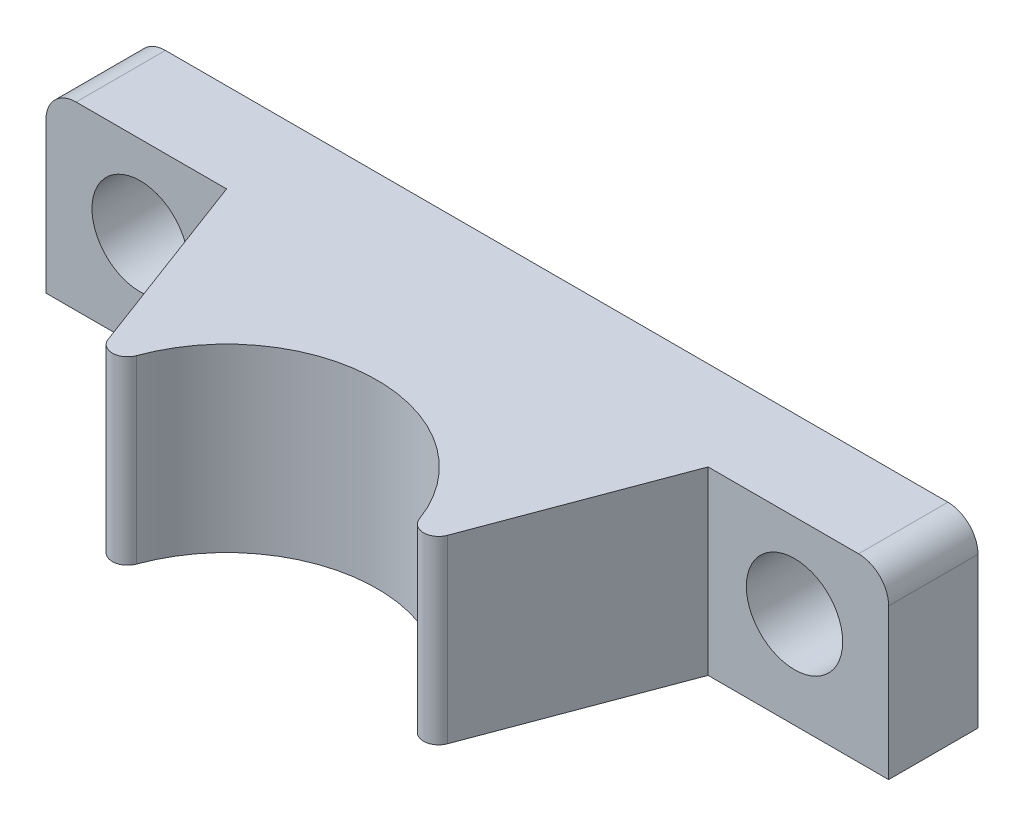
ISO-10303-21;
HEADER;
FILE_DESCRIPTION(('STEP AP214'),'2;1');
FILE_NAME('part.step','',(''),(''),'','','');
FILE_SCHEMA(('AUTOMOTIVE_DESIGN { 1 0 10303 214 1 1 1 1 }'));
ENDSEC;
DATA;
#1=APPLICATION_CONTEXT('core data for automotive mechanical design processes');
#2=APPLICATION_PROTOCOL_DEFINITION('international standard','automotive_design',2000,#1);
#3=PRODUCT_CONTEXT('',#1,'mechanical');
#4=PRODUCT('Part','Part','',(#3));
#5=PRODUCT_RELATED_PRODUCT_CATEGORY('part','',(#4));
#6=PRODUCT_DEFINITION_FORMATION('','',#4);
#7=PRODUCT_DEFINITION_CONTEXT('part definition',#1,'design');
#8=PRODUCT_DEFINITION('design','',#6,#7);
#9=PRODUCT_DEFINITION_SHAPE('','',#8);
#10=(LENGTH_UNIT() NAMED_UNIT(*) SI_UNIT(.MILLI.,.METRE.));
#11=(NAMED_UNIT(*) PLANE_ANGLE_UNIT() SI_UNIT($,.RADIAN.));
#12=(NAMED_UNIT(*) SI_UNIT($,.STERADIAN.) SOLID_ANGLE_UNIT());
#13=UNCERTAINTY_MEASURE_WITH_UNIT(LENGTH_MEASURE(1.E-05),#10,'distance_accuracy_value','');
#14=(GEOMETRIC_REPRESENTATION_CONTEXT(3) GLOBAL_UNCERTAINTY_ASSIGNED_CONTEXT((#13)) GLOBAL_UNIT_ASSIGNED_CONTEXT((#10,
#11,#12)) REPRESENTATION_CONTEXT('',''));
#15=CARTESIAN_POINT('',(0.,0.,0.));
#16=DIRECTION('',(0.,0.,1.));
#17=DIRECTION('',(1.,0.,0.));
#18=AXIS2_PLACEMENT_3D('',#15,#16,#17);
#19=CARTESIAN_POINT('',(17.6143708985289,35.4634604627299,38.1716360974316));
#20=DIRECTION('',(-1.,0.,0.));
#21=DIRECTION('',(0.,0.,1.));
#22=AXIS2_PLACEMENT_3D('',#19,#20,#21);
#23=PLANE('',#22);
#24=DIRECTION('',(0.,1.,0.));
#25=VECTOR('',#24,1.);
#26=CARTESIAN_POINT('',(17.6143708985289,35.4634604627299,38.1716360974316));
#27=LINE('',#26,#25);
#28=CARTESIAN_POINT('',(17.6143708985289,35.4634604627299,38.1716360974316));
#29=VERTEX_POINT('',#28);
#30=CARTESIAN_POINT('',(17.6143708985289,40.4634604627299,38.1716360974316));
#31=VERTEX_POINT('',#30);
#32=EDGE_CURVE('E138',#29,#31,#27,.T.);
#33=ORIENTED_EDGE('',*,*,#32,.T.);
#34=DIRECTION('',(0.,0.,1.));
#35=VECTOR('',#34,1.);
#36=CARTESIAN_POINT('',(17.6143708985289,40.4634604627299,38.1716360974316));
#37=LINE('',#36,#35);
#38=CARTESIAN_POINT('',(17.6143708985289,40.4634604627299,35.2025647253161));
#39=VERTEX_POINT('',#38);
#40=EDGE_CURVE('E236',#31,#39,#37,.F.);
#41=ORIENTED_EDGE('',*,*,#40,.T.);
#42=DIRECTION('',(0.,1.,0.));
#43=VECTOR('',#42,1.);
#44=CARTESIAN_POINT('',(17.6143708985289,35.4634604627299,35.2025647253161));
#45=LINE('',#44,#43);
#46=CARTESIAN_POINT('',(17.6143708985289,35.4634604627299,35.2025647253161));
#47=VERTEX_POINT('',#46);
#48=EDGE_CURVE('E161',#47,#39,#45,.T.);
#49=ORIENTED_EDGE('',*,*,#48,.F.);
#50=DIRECTION('',(0.,0.,1.));
#51=VECTOR('',#50,1.);
#52=CARTESIAN_POINT('',(17.6143708985289,35.4634604627299,38.1716360974316));
#53=LINE('',#52,#51);
#54=EDGE_CURVE('E155',#47,#29,#53,.T.);
#55=ORIENTED_EDGE('',*,*,#54,.T.);
#56=EDGE_LOOP('',(#33,#41,#49,#55));
#57=FACE_BOUND('',#56,.T.);
#58=ADVANCED_FACE('F43',(#57),#23,.T.);
#59=CARTESIAN_POINT('',(17.6143708985289,35.4634604627299,35.2025647253161));
#60=DIRECTION('',(0.,0.,-1.));
#61=DIRECTION('',(-1.,0.,0.));
#62=AXIS2_PLACEMENT_3D('',#59,#60,#61);
#63=PLANE('',#62);
#64=CARTESIAN_POINT('',(20.7421375200377,38.6634604627299,35.2025647253161));
#65=DIRECTION('',(0.,0.,-1.));
#66=DIRECTION('',(-1.,0.,0.));
#67=AXIS2_PLACEMENT_3D('',#64,#65,#66);
#68=CIRCLE('',#67,1.6);
#69=CARTESIAN_POINT('',(19.1421375200377,38.6634604627299,35.2025647253161));
#70=VERTEX_POINT('',#69);
#71=EDGE_CURVE('E271',#70,#70,#68,.T.);
#72=ORIENTED_EDGE('',*,*,#71,.F.);
#73=EDGE_LOOP('',(#72));
#74=FACE_BOUND('',#73,.T.);
#75=CARTESIAN_POINT('',(42.4866042770202,38.6634604627299,35.2025647253161));
#76=DIRECTION('',(0.,0.,-1.));
#77=DIRECTION('',(-1.,0.,0.));
#78=AXIS2_PLACEMENT_3D('',#75,#76,#77);
#79=CIRCLE('',#78,1.6);
#80=CARTESIAN_POINT('',(40.8866042770202,38.6634604627299,35.2025647253161));
#81=VERTEX_POINT('',#80);
#82=EDGE_CURVE('E172',#81,#81,#79,.T.);
#83=ORIENTED_EDGE('',*,*,#82,.F.);
#84=EDGE_LOOP('',(#83));
#85=FACE_BOUND('',#84,.T.);
#86=ORIENTED_EDGE('',*,*,#48,.T.);
#87=CARTESIAN_POINT('',(18.6143708985289,40.4634604627299,35.2025647253161));
#88=DIRECTION('',(0.,0.,-1.));
#89=DIRECTION('',(-1.,0.,0.));
#90=AXIS2_PLACEMENT_3D('',#87,#88,#89);
#91=CIRCLE('',#90,1.);
#92=CARTESIAN_POINT('',(18.6143708985289,41.4634604627299,35.2025647253161));
#93=VERTEX_POINT('',#92);
#94=EDGE_CURVE('E242',#39,#93,#91,.T.);
#95=ORIENTED_EDGE('',*,*,#94,.T.);
#96=DIRECTION('',(-1.,0.,0.));
#97=VECTOR('',#96,1.);
#98=CARTESIAN_POINT('',(17.6143708985289,41.4634604627299,35.2025647253161));
#99=LINE('',#98,#97);
#100=CARTESIAN_POINT('',(44.6143708985289,41.4634604627299,35.2025647253161));
#101=VERTEX_POINT('',#100);
#102=EDGE_CURVE('E163',#101,#93,#99,.T.);
#103=ORIENTED_EDGE('',*,*,#102,.F.);
#104=CARTESIAN_POINT('',(44.6143708985289,40.4634604627299,35.2025647253161));
#105=DIRECTION('',(0.,0.,-1.));
#106=DIRECTION('',(-1.,0.,0.));
#107=AXIS2_PLACEMENT_3D('',#104,#105,#106);
#108=CIRCLE('',#107,1.);
#109=CARTESIAN_POINT('',(45.6143708985289,40.4634604627299,35.2025647253161));
#110=VERTEX_POINT('',#109);
#111=EDGE_CURVE('E239',#101,#110,#108,.T.);
#112=ORIENTED_EDGE('',*,*,#111,.T.);
#113=DIRECTION('',(0.,1.,0.));
#114=VECTOR('',#113,1.);
#115=CARTESIAN_POINT('',(45.6143708985289,35.4634604627299,35.2025647253161));
#116=LINE('',#115,#114);
#117=CARTESIAN_POINT('',(45.6143708985289,35.4634604627299,35.2025647253161));
#118=VERTEX_POINT('',#117);
#119=EDGE_CURVE('E213',#118,#110,#116,.T.);
#120=ORIENTED_EDGE('',*,*,#119,.F.);
#121=DIRECTION('',(-1.,0.,0.));
#122=VECTOR('',#121,1.);
#123=CARTESIAN_POINT('',(17.6143708985289,35.4634604627299,35.2025647253161));
#124=LINE('',#123,#122);
#125=EDGE_CURVE('E150',#118,#47,#124,.T.);
#126=ORIENTED_EDGE('',*,*,#125,.T.);
#127=EDGE_LOOP('',(#86,#95,#103,#112,#120,#126));
#128=FACE_BOUND('',#127,.T.);
#129=ADVANCED_FACE('F286',(#74,#85,#128),#63,.T.);
#130=CARTESIAN_POINT('',(45.6143708985289,35.4634604627299,38.1716360974316));
#131=DIRECTION('',(1.,0.,0.));
#132=DIRECTION('',(0.,0.,-1.));
#133=AXIS2_PLACEMENT_3D('',#130,#131,#132);
#134=PLANE('',#133);
#135=ORIENTED_EDGE('',*,*,#119,.T.);
#136=DIRECTION('',(0.,0.,-1.));
#137=VECTOR('',#136,1.);
#138=CARTESIAN_POINT('',(45.6143708985289,40.4634604627299,38.1716360974316));
#139=LINE('',#138,#137);
#140=CARTESIAN_POINT('',(45.6143708985289,40.4634604627299,38.1716360974316));
#141=VERTEX_POINT('',#140);
#142=EDGE_CURVE('E245',#110,#141,#139,.F.);
#143=ORIENTED_EDGE('',*,*,#142,.T.);
#144=DIRECTION('',(0.,1.,0.));
#145=VECTOR('',#144,1.);
#146=CARTESIAN_POINT('',(45.6143708985289,35.4634604627299,38.1716360974316));
#147=LINE('',#146,#145);
#148=CARTESIAN_POINT('',(45.6143708985289,35.4634604627299,38.1716360974316));
#149=VERTEX_POINT('',#148);
#150=EDGE_CURVE('E217',#149,#141,#147,.T.);
#151=ORIENTED_EDGE('',*,*,#150,.F.);
#152=DIRECTION('',(0.,0.,-1.));
#153=VECTOR('',#152,1.);
#154=CARTESIAN_POINT('',(45.6143708985289,35.4634604627299,38.1716360974316));
#155=LINE('',#154,#153);
#156=EDGE_CURVE('E188',#149,#118,#155,.T.);
#157=ORIENTED_EDGE('',*,*,#156,.T.);
#158=EDGE_LOOP('',(#135,#143,#151,#157));
#159=FACE_BOUND('',#158,.T.);
#160=ADVANCED_FACE('F289',(#159),#134,.T.);
#161=CARTESIAN_POINT('',(39.6143708985289,35.4634604627299,38.1716360974316));
#162=DIRECTION('',(0.,0.,1.));
#163=DIRECTION('',(1.,0.,0.));
#164=AXIS2_PLACEMENT_3D('',#161,#162,#163);
#165=PLANE('',#164);
#166=CARTESIAN_POINT('',(42.4866042770202,38.6634604627299,38.1716360974316));
#167=DIRECTION('',(0.,0.,1.));
#168=DIRECTION('',(1.,0.,0.));
#169=AXIS2_PLACEMENT_3D('',#166,#167,#168);
#170=CIRCLE('',#169,1.6);
#171=CARTESIAN_POINT('',(44.0866042770202,38.6634604627299,38.1716360974316));
#172=VERTEX_POINT('',#171);
#173=EDGE_CURVE('E47',#172,#172,#170,.T.);
#174=ORIENTED_EDGE('',*,*,#173,.F.);
#175=EDGE_LOOP('',(#174));
#176=FACE_BOUND('',#175,.T.);
#177=ORIENTED_EDGE('',*,*,#150,.T.);
#178=CARTESIAN_POINT('',(44.6143708985289,40.4634604627299,38.1716360974316));
#179=DIRECTION('',(0.,0.,1.));
#180=DIRECTION('',(1.,0.,0.));
#181=AXIS2_PLACEMENT_3D('',#178,#179,#180);
#182=CIRCLE('',#181,1.);
#183=CARTESIAN_POINT('',(44.6143708985289,41.4634604627299,38.1716360974316));
#184=VERTEX_POINT('',#183);
#185=EDGE_CURVE('E248',#141,#184,#182,.T.);
#186=ORIENTED_EDGE('',*,*,#185,.T.);
#187=DIRECTION('',(1.,0.,0.));
#188=VECTOR('',#187,1.);
#189=CARTESIAN_POINT('',(39.6143708985289,41.4634604627299,38.1716360974316));
#190=LINE('',#189,#188);
#191=CARTESIAN_POINT('',(39.6143708985289,41.4634604627299,38.1716360974316));
#192=VERTEX_POINT('',#191);
#193=EDGE_CURVE('E169',#192,#184,#190,.T.);
#194=ORIENTED_EDGE('',*,*,#193,.F.);
#195=DIRECTION('',(0.,1.,0.));
#196=VECTOR('',#195,1.);
#197=CARTESIAN_POINT('',(39.6143708985289,35.4634604627299,38.1716360974316));
#198=LINE('',#197,#196);
#199=CARTESIAN_POINT('',(39.6143708985289,35.4634604627299,38.1716360974316));
#200=VERTEX_POINT('',#199);
#201=EDGE_CURVE('E221',#200,#192,#198,.T.);
#202=ORIENTED_EDGE('',*,*,#201,.F.);
#203=DIRECTION('',(1.,0.,0.));
#204=VECTOR('',#203,1.);
#205=CARTESIAN_POINT('',(39.6143708985289,35.4634604627299,38.1716360974316));
#206=LINE('',#205,#204);
#207=EDGE_CURVE('E184',#200,#149,#206,.T.);
#208=ORIENTED_EDGE('',*,*,#207,.T.);
#209=EDGE_LOOP('',(#177,#186,#194,#202,#208));
#210=FACE_BOUND('',#209,.T.);
#211=ADVANCED_FACE('F337',(#176,#210),#165,.T.);
#212=CARTESIAN_POINT('',(39.6143708985289,35.4634604627299,38.1716360974316));
#213=DIRECTION('',(0.936329177569045,0.,0.351123441588391));
#214=DIRECTION('',(0.351123441588391,0.,-0.936329177569045));
#215=AXIS2_PLACEMENT_3D('',#212,#213,#214);
#216=PLANE('',#215);
#217=DIRECTION('',(0.351123441588391,0.,-0.936329177569045));
#218=VECTOR('',#217,1.);
#219=CARTESIAN_POINT('',(39.6143708985289,41.4634604627299,38.1716360974316));
#220=LINE('',#219,#218);
#221=CARTESIAN_POINT('',(37.2523741799725,41.4634604627299,44.4702940135822));
#222=VERTEX_POINT('',#221);
#223=EDGE_CURVE('E204',#222,#192,#220,.T.);
#224=ORIENTED_EDGE('',*,*,#223,.F.);
#225=DIRECTION('',(0.,1.,0.));
#226=VECTOR('',#225,1.);
#227=CARTESIAN_POINT('',(37.2523741799725,35.4634604627299,44.4702940135822));
#228=LINE('',#227,#226);
#229=CARTESIAN_POINT('',(37.2523741799725,35.4634604627299,44.4702940135822));
#230=VERTEX_POINT('',#229);
#231=EDGE_CURVE('E69',#222,#230,#228,.F.);
#232=ORIENTED_EDGE('',*,*,#231,.T.);
#233=DIRECTION('',(0.351123441588391,0.,-0.936329177569045));
#234=VECTOR('',#233,1.);
#235=CARTESIAN_POINT('',(39.6143708985289,35.4634604627299,38.1716360974316));
#236=LINE('',#235,#234);
#237=EDGE_CURVE('E181',#230,#200,#236,.T.);
#238=ORIENTED_EDGE('',*,*,#237,.T.);
#239=ORIENTED_EDGE('',*,*,#201,.T.);
#240=EDGE_LOOP('',(#224,#232,#238,#239));
#241=FACE_BOUND('',#240,.T.);
#242=ADVANCED_FACE('F339',(#241),#216,.T.);
#243=CARTESIAN_POINT('',(31.6143708985289,35.4634604627299,46.1716360974316));
#244=DIRECTION('',(0.,1.,0.));
#245=DIRECTION('',(0.,0.,1.));
#246=AXIS2_PLACEMENT_3D('',#243,#244,#245);
#247=CYLINDRICAL_SURFACE('',#246,5.);
#248=CARTESIAN_POINT('',(31.6143708985289,35.4634604627299,46.1716360974316));
#249=DIRECTION('',(0.,-1.,0.));
#250=DIRECTION('',(0.,0.,1.));
#251=AXIS2_PLACEMENT_3D('',#248,#249,#250);
#252=CIRCLE('',#251,5.);
#253=CARTESIAN_POINT('',(26.9145175415662,35.4634604627299,44.4653599113919));
#254=VERTEX_POINT('',#253);
#255=CARTESIAN_POINT('',(36.3142242554917,35.4634604627299,44.4653599113919));
#256=VERTEX_POINT('',#255);
#257=EDGE_CURVE('E177',#254,#256,#252,.T.);
#258=ORIENTED_EDGE('',*,*,#257,.T.);
#259=DIRECTION('',(0.,1.,0.));
#260=VECTOR('',#259,1.);
#261=CARTESIAN_POINT('',(36.3142242554917,35.4634604627299,44.4653599113919));
#262=LINE('',#261,#260);
#263=CARTESIAN_POINT('',(36.3142242554917,41.4634604627299,44.4653599113919));
#264=VERTEX_POINT('',#263);
#265=EDGE_CURVE('E253',#256,#264,#262,.T.);
#266=ORIENTED_EDGE('',*,*,#265,.T.);
#267=CARTESIAN_POINT('',(31.6143708985289,41.4634604627299,46.1716360974316));
#268=DIRECTION('',(0.,-1.,0.));
#269=DIRECTION('',(0.,0.,1.));
#270=AXIS2_PLACEMENT_3D('',#267,#268,#269);
#271=CIRCLE('',#270,5.);
#272=CARTESIAN_POINT('',(26.9145175415662,41.4634604627299,44.4653599113919));
#273=VERTEX_POINT('',#272);
#274=EDGE_CURVE('E201',#273,#264,#271,.T.);
#275=ORIENTED_EDGE('',*,*,#274,.F.);
#276=DIRECTION('',(0.,1.,0.));
#277=VECTOR('',#276,1.);
#278=CARTESIAN_POINT('',(26.9145175415662,35.4634604627299,44.4653599113919));
#279=LINE('',#278,#277);
#280=EDGE_CURVE('E250',#273,#254,#279,.F.);
#281=ORIENTED_EDGE('',*,*,#280,.T.);
#282=EDGE_LOOP('',(#258,#266,#275,#281));
#283=FACE_BOUND('',#282,.T.);
#284=ADVANCED_FACE('F307',(#283),#247,.F.);
#285=CARTESIAN_POINT('',(26.6143708985289,35.4634604627299,46.1716360974316));
#286=DIRECTION('',(-0.936329177569045,0.,0.351123441588391));
#287=DIRECTION('',(0.351123441588391,0.,0.936329177569045));
#288=AXIS2_PLACEMENT_3D('',#285,#286,#287);
#289=PLANE('',#288);
#290=DIRECTION('',(0.351123441588391,0.,0.936329177569045));
#291=VECTOR('',#290,1.);
#292=CARTESIAN_POINT('',(26.6143708985289,35.4634604627299,46.1716360974316));
#293=LINE('',#292,#291);
#294=CARTESIAN_POINT('',(23.6143708985289,35.4634604627299,38.1716360974316));
#295=VERTEX_POINT('',#294);
#296=CARTESIAN_POINT('',(25.9763676170854,35.4634604627299,44.4702940135821));
#297=VERTEX_POINT('',#296);
#298=EDGE_CURVE('E157',#295,#297,#293,.T.);
#299=ORIENTED_EDGE('',*,*,#298,.T.);
#300=DIRECTION('',(0.,1.,0.));
#301=VECTOR('',#300,1.);
#302=CARTESIAN_POINT('',(25.9763676170854,35.4634604627299,44.4702940135821));
#303=LINE('',#302,#301);
#304=CARTESIAN_POINT('',(25.9763676170854,41.4634604627299,44.4702940135821));
#305=VERTEX_POINT('',#304);
#306=EDGE_CURVE('E11',#297,#305,#303,.T.);
#307=ORIENTED_EDGE('',*,*,#306,.T.);
#308=DIRECTION('',(0.351123441588391,0.,0.936329177569045));
#309=VECTOR('',#308,1.);
#310=CARTESIAN_POINT('',(26.6143708985289,41.4634604627299,46.1716360974316));
#311=LINE('',#310,#309);
#312=CARTESIAN_POINT('',(23.6143708985289,41.4634604627299,38.1716360974316));
#313=VERTEX_POINT('',#312);
#314=EDGE_CURVE('E197',#313,#305,#311,.T.);
#315=ORIENTED_EDGE('',*,*,#314,.F.);
#316=DIRECTION('',(0.,1.,0.));
#317=VECTOR('',#316,1.);
#318=CARTESIAN_POINT('',(23.6143708985289,35.4634604627299,38.1716360974316));
#319=LINE('',#318,#317);
#320=EDGE_CURVE('E149',#295,#313,#319,.T.);
#321=ORIENTED_EDGE('',*,*,#320,.F.);
#322=EDGE_LOOP('',(#299,#307,#315,#321));
#323=FACE_BOUND('',#322,.T.);
#324=ADVANCED_FACE('F301',(#323),#289,.T.);
#325=CARTESIAN_POINT('',(17.6143708985289,35.4634604627299,38.1716360974316));
#326=DIRECTION('',(0.,0.,1.));
#327=DIRECTION('',(1.,0.,0.));
#328=AXIS2_PLACEMENT_3D('',#325,#326,#327);
#329=PLANE('',#328);
#330=CARTESIAN_POINT('',(20.7421375200377,38.6634604627299,38.1716360974316));
#331=DIRECTION('',(0.,0.,1.));
#332=DIRECTION('',(1.,0.,0.));
#333=AXIS2_PLACEMENT_3D('',#330,#331,#332);
#334=CIRCLE('',#333,1.6);
#335=CARTESIAN_POINT('',(22.3421375200377,38.6634604627299,38.1716360974316));
#336=VERTEX_POINT('',#335);
#337=EDGE_CURVE('E268',#336,#336,#334,.T.);
#338=ORIENTED_EDGE('',*,*,#337,.F.);
#339=EDGE_LOOP('',(#338));
#340=FACE_BOUND('',#339,.T.);
#341=DIRECTION('',(1.,0.,0.));
#342=VECTOR('',#341,1.);
#343=CARTESIAN_POINT('',(17.6143708985289,41.4634604627299,38.1716360974316));
#344=LINE('',#343,#342);
#345=CARTESIAN_POINT('',(18.6143708985289,41.4634604627299,38.1716360974316));
#346=VERTEX_POINT('',#345);
#347=EDGE_CURVE('E194',#346,#313,#344,.T.);
#348=ORIENTED_EDGE('',*,*,#347,.F.);
#349=CARTESIAN_POINT('',(18.6143708985289,40.4634604627299,38.1716360974316));
#350=DIRECTION('',(0.,0.,1.));
#351=DIRECTION('',(1.,0.,0.));
#352=AXIS2_PLACEMENT_3D('',#349,#350,#351);
#353=CIRCLE('',#352,1.);
#354=EDGE_CURVE('E144',#346,#31,#353,.T.);
#355=ORIENTED_EDGE('',*,*,#354,.T.);
#356=ORIENTED_EDGE('',*,*,#32,.F.);
#357=DIRECTION('',(1.,0.,0.));
#358=VECTOR('',#357,1.);
#359=CARTESIAN_POINT('',(17.6143708985289,35.4634604627299,38.1716360974316));
#360=LINE('',#359,#358);
#361=EDGE_CURVE('E143',#29,#295,#360,.T.);
#362=ORIENTED_EDGE('',*,*,#361,.T.);
#363=ORIENTED_EDGE('',*,*,#320,.T.);
#364=EDGE_LOOP('',(#348,#355,#356,#362,#363));
#365=FACE_BOUND('',#364,.T.);
#366=ADVANCED_FACE('F141',(#340,#365),#329,.T.);
#367=CARTESIAN_POINT('',(31.6143708985289,35.4634604627299,46.1716360974316));
#368=DIRECTION('',(0.,1.,0.));
#369=DIRECTION('',(0.,0.,1.));
#370=AXIS2_PLACEMENT_3D('',#367,#368,#369);
#371=PLANE('',#370);
#372=ORIENTED_EDGE('',*,*,#237,.F.);
#373=CARTESIAN_POINT('',(36.7842095911879,35.4634604627299,44.294732292788));
#374=DIRECTION('',(0.,1.,0.));
#375=DIRECTION('',(0.,0.,1.));
#376=AXIS2_PLACEMENT_3D('',#373,#374,#375);
#377=CIRCLE('',#376,0.5);
#378=EDGE_CURVE('E53',#230,#256,#377,.F.);
#379=ORIENTED_EDGE('',*,*,#378,.T.);
#380=ORIENTED_EDGE('',*,*,#257,.F.);
#381=CARTESIAN_POINT('',(26.4445322058699,35.4634604627299,44.294732292788));
#382=DIRECTION('',(0.,1.,0.));
#383=DIRECTION('',(0.,0.,1.));
#384=AXIS2_PLACEMENT_3D('',#381,#382,#383);
#385=CIRCLE('',#384,0.5);
#386=EDGE_CURVE('E61',#254,#297,#385,.F.);
#387=ORIENTED_EDGE('',*,*,#386,.T.);
#388=ORIENTED_EDGE('',*,*,#298,.F.);
#389=ORIENTED_EDGE('',*,*,#361,.F.);
#390=ORIENTED_EDGE('',*,*,#54,.F.);
#391=ORIENTED_EDGE('',*,*,#125,.F.);
#392=ORIENTED_EDGE('',*,*,#156,.F.);
#393=ORIENTED_EDGE('',*,*,#207,.F.);
#394=EDGE_LOOP('',(#372,#379,#380,#387,#388,#389,#390,#391,#392,#393));
#395=FACE_BOUND('',#394,.T.);
#396=ADVANCED_FACE('F153',(#395),#371,.F.);
#397=CARTESIAN_POINT('',(31.6143708985289,41.4634604627299,46.1716360974316));
#398=DIRECTION('',(0.,1.,0.));
#399=DIRECTION('',(0.,0.,1.));
#400=AXIS2_PLACEMENT_3D('',#397,#398,#399);
#401=PLANE('',#400);
#402=ORIENTED_EDGE('',*,*,#274,.T.);
#403=CARTESIAN_POINT('',(36.7842095911879,41.4634604627299,44.294732292788));
#404=DIRECTION('',(0.,1.,0.));
#405=DIRECTION('',(0.,0.,1.));
#406=AXIS2_PLACEMENT_3D('',#403,#404,#405);
#407=CIRCLE('',#406,0.5);
#408=EDGE_CURVE('E260',#264,#222,#407,.T.);
#409=ORIENTED_EDGE('',*,*,#408,.T.);
#410=ORIENTED_EDGE('',*,*,#223,.T.);
#411=ORIENTED_EDGE('',*,*,#193,.T.);
#412=DIRECTION('',(0.,0.,-1.));
#413=VECTOR('',#412,1.);
#414=CARTESIAN_POINT('',(44.6143708985289,41.4634604627299,46.1716360974316));
#415=LINE('',#414,#413);
#416=EDGE_CURVE('E212',#184,#101,#415,.T.);
#417=ORIENTED_EDGE('',*,*,#416,.T.);
#418=ORIENTED_EDGE('',*,*,#102,.T.);
#419=DIRECTION('',(0.,0.,1.));
#420=VECTOR('',#419,1.);
#421=CARTESIAN_POINT('',(18.6143708985289,41.4634604627299,46.1716360974316));
#422=LINE('',#421,#420);
#423=EDGE_CURVE('E230',#93,#346,#422,.T.);
#424=ORIENTED_EDGE('',*,*,#423,.T.);
#425=ORIENTED_EDGE('',*,*,#347,.T.);
#426=ORIENTED_EDGE('',*,*,#314,.T.);
#427=CARTESIAN_POINT('',(26.4445322058699,41.4634604627299,44.294732292788));
#428=DIRECTION('',(0.,1.,0.));
#429=DIRECTION('',(0.,0.,1.));
#430=AXIS2_PLACEMENT_3D('',#427,#428,#429);
#431=CIRCLE('',#430,0.5);
#432=EDGE_CURVE('E257',#305,#273,#431,.T.);
#433=ORIENTED_EDGE('',*,*,#432,.T.);
#434=EDGE_LOOP('',(#402,#409,#410,#411,#417,#418,#424,#425,#426,#433));
#435=FACE_BOUND('',#434,.T.);
#436=ADVANCED_FACE('F298',(#435),#401,.T.);
#437=CARTESIAN_POINT('',(18.6143708985289,40.4634604627299,46.1716360974316));
#438=DIRECTION('',(0.,0.,1.));
#439=DIRECTION('',(1.,0.,0.));
#440=AXIS2_PLACEMENT_3D('',#437,#438,#439);
#441=CYLINDRICAL_SURFACE('',#440,1.);
#442=ORIENTED_EDGE('',*,*,#94,.F.);
#443=ORIENTED_EDGE('',*,*,#40,.F.);
#444=ORIENTED_EDGE('',*,*,#354,.F.);
#445=ORIENTED_EDGE('',*,*,#423,.F.);
#446=EDGE_LOOP('',(#442,#443,#444,#445));
#447=FACE_BOUND('',#446,.T.);
#448=ADVANCED_FACE('F296',(#447),#441,.T.);
#449=CARTESIAN_POINT('',(44.6143708985289,40.4634604627299,46.1716360974316));
#450=DIRECTION('',(0.,0.,-1.));
#451=DIRECTION('',(-1.,0.,0.));
#452=AXIS2_PLACEMENT_3D('',#449,#450,#451);
#453=CYLINDRICAL_SURFACE('',#452,1.);
#454=ORIENTED_EDGE('',*,*,#185,.F.);
#455=ORIENTED_EDGE('',*,*,#142,.F.);
#456=ORIENTED_EDGE('',*,*,#111,.F.);
#457=ORIENTED_EDGE('',*,*,#416,.F.);
#458=EDGE_LOOP('',(#454,#455,#456,#457));
#459=FACE_BOUND('',#458,.T.);
#460=ADVANCED_FACE('F317',(#459),#453,.T.);
#461=CARTESIAN_POINT('',(36.7842095911879,35.4634604627299,44.294732292788));
#462=DIRECTION('',(0.,1.,0.));
#463=DIRECTION('',(0.,0.,1.));
#464=AXIS2_PLACEMENT_3D('',#461,#462,#463);
#465=CYLINDRICAL_SURFACE('',#464,0.5);
#466=ORIENTED_EDGE('',*,*,#378,.F.);
#467=ORIENTED_EDGE('',*,*,#231,.F.);
#468=ORIENTED_EDGE('',*,*,#408,.F.);
#469=ORIENTED_EDGE('',*,*,#265,.F.);
#470=EDGE_LOOP('',(#466,#467,#468,#469));
#471=FACE_BOUND('',#470,.T.);
#472=ADVANCED_FACE('F311',(#471),#465,.T.);
#473=CARTESIAN_POINT('',(26.4445322058699,35.4634604627299,44.294732292788));
#474=DIRECTION('',(0.,1.,0.));
#475=DIRECTION('',(0.,0.,1.));
#476=AXIS2_PLACEMENT_3D('',#473,#474,#475);
#477=CYLINDRICAL_SURFACE('',#476,0.5);
#478=ORIENTED_EDGE('',*,*,#386,.F.);
#479=ORIENTED_EDGE('',*,*,#280,.F.);
#480=ORIENTED_EDGE('',*,*,#432,.F.);
#481=ORIENTED_EDGE('',*,*,#306,.F.);
#482=EDGE_LOOP('',(#478,#479,#480,#481));
#483=FACE_BOUND('',#482,.T.);
#484=ADVANCED_FACE('F45',(#483),#477,.T.);
#485=CARTESIAN_POINT('',(20.7421375200377,38.6634604627299,45.2025647253161));
#486=DIRECTION('',(0.,0.,-1.));
#487=DIRECTION('',(-1.,0.,0.));
#488=AXIS2_PLACEMENT_3D('',#485,#486,#487);
#489=CYLINDRICAL_SURFACE('',#488,1.6);
#490=ORIENTED_EDGE('',*,*,#337,.T.);
#491=EDGE_LOOP('',(#490));
#492=FACE_BOUND('',#491,.T.);
#493=ORIENTED_EDGE('',*,*,#71,.T.);
#494=EDGE_LOOP('',(#493));
#495=FACE_BOUND('',#494,.T.);
#496=ADVANCED_FACE('F310',(#492,#495),#489,.F.);
#497=CARTESIAN_POINT('',(42.4866042770202,38.6634604627299,45.2025647253161));
#498=DIRECTION('',(0.,0.,-1.));
#499=DIRECTION('',(-1.,0.,0.));
#500=AXIS2_PLACEMENT_3D('',#497,#498,#499);
#501=CYLINDRICAL_SURFACE('',#500,1.6);
#502=ORIENTED_EDGE('',*,*,#173,.T.);
#503=EDGE_LOOP('',(#502));
#504=FACE_BOUND('',#503,.T.);
#505=ORIENTED_EDGE('',*,*,#82,.T.);
#506=EDGE_LOOP('',(#505));
#507=FACE_BOUND('',#506,.T.);
#508=ADVANCED_FACE('F284',(#504,#507),#501,.F.);
#509=CLOSED_SHELL('',(#58,#129,#160,#211,#242,#284,#324,#366,#396,#436,#448,#460,#472,#484,#496,#508));
#510=MANIFOLD_SOLID_BREP('B2',#509);
#511=ADVANCED_BREP_SHAPE_REPRESENTATION('',(#18,#510),#14);
#512=SHAPE_DEFINITION_REPRESENTATION(#9,#511);
ENDSEC;
END-ISO-10303-21;
